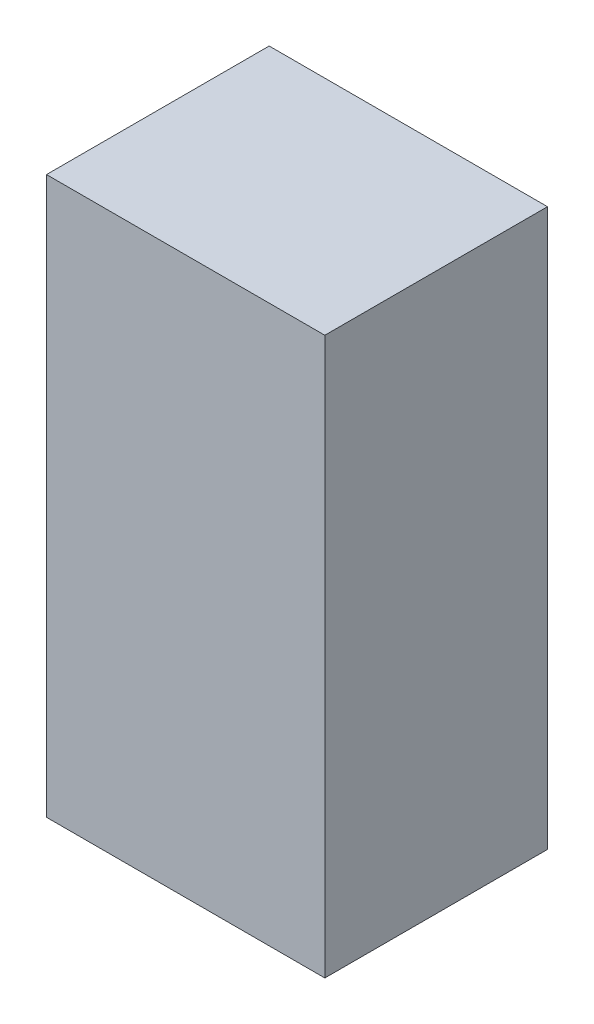
ISO-10303-21;
HEADER;
FILE_DESCRIPTION(('STEP AP214'),'2;1');
FILE_NAME('part.step','',(''),(''),'','','');
FILE_SCHEMA(('AUTOMOTIVE_DESIGN { 1 0 10303 214 1 1 1 1 }'));
ENDSEC;
DATA;
#1=APPLICATION_CONTEXT('core data for automotive mechanical design processes');
#2=APPLICATION_PROTOCOL_DEFINITION('international standard','automotive_design',2000,#1);
#3=PRODUCT_CONTEXT('',#1,'mechanical');
#4=PRODUCT('Part','Part','',(#3));
#5=PRODUCT_RELATED_PRODUCT_CATEGORY('part','',(#4));
#6=PRODUCT_DEFINITION_FORMATION('','',#4);
#7=PRODUCT_DEFINITION_CONTEXT('part definition',#1,'design');
#8=PRODUCT_DEFINITION('design','',#6,#7);
#9=PRODUCT_DEFINITION_SHAPE('','',#8);
#10=(LENGTH_UNIT() NAMED_UNIT(*) SI_UNIT(.MILLI.,.METRE.));
#11=(NAMED_UNIT(*) PLANE_ANGLE_UNIT() SI_UNIT($,.RADIAN.));
#12=(NAMED_UNIT(*) SI_UNIT($,.STERADIAN.) SOLID_ANGLE_UNIT());
#13=UNCERTAINTY_MEASURE_WITH_UNIT(LENGTH_MEASURE(1.E-05),#10,'distance_accuracy_value','');
#14=(GEOMETRIC_REPRESENTATION_CONTEXT(3) GLOBAL_UNCERTAINTY_ASSIGNED_CONTEXT((#13)) GLOBAL_UNIT_ASSIGNED_CONTEXT((#10,
#11,#12)) REPRESENTATION_CONTEXT('',''));
#15=CARTESIAN_POINT('',(0.,0.,0.));
#16=DIRECTION('',(0.,0.,1.));
#17=DIRECTION('',(1.,0.,0.));
#18=AXIS2_PLACEMENT_3D('',#15,#16,#17);
#19=CARTESIAN_POINT('',(37.5,75.,60.));
#20=DIRECTION('',(0.,-1.,0.));
#21=DIRECTION('',(0.,0.,-1.));
#22=AXIS2_PLACEMENT_3D('',#19,#20,#21);
#23=PLANE('',#22);
#24=DIRECTION('',(-1.,0.,0.));
#25=VECTOR('',#24,1.);
#26=CARTESIAN_POINT('',(37.5,75.,0.));
#27=LINE('',#26,#25);
#28=CARTESIAN_POINT('',(37.5,75.,0.));
#29=VERTEX_POINT('',#28);
#30=CARTESIAN_POINT('',(-37.5,75.,0.));
#31=VERTEX_POINT('',#30);
#32=EDGE_CURVE('E102',#29,#31,#27,.T.);
#33=ORIENTED_EDGE('',*,*,#32,.T.);
#34=DIRECTION('',(0.,0.,-1.));
#35=VECTOR('',#34,1.);
#36=CARTESIAN_POINT('',(-37.5,75.,60.));
#37=LINE('',#36,#35);
#38=CARTESIAN_POINT('',(-37.5,75.,60.));
#39=VERTEX_POINT('',#38);
#40=EDGE_CURVE('E11',#39,#31,#37,.T.);
#41=ORIENTED_EDGE('',*,*,#40,.F.);
#42=DIRECTION('',(-1.,0.,0.));
#43=VECTOR('',#42,1.);
#44=CARTESIAN_POINT('',(37.5,75.,60.));
#45=LINE('',#44,#43);
#46=CARTESIAN_POINT('',(37.5,75.,60.));
#47=VERTEX_POINT('',#46);
#48=EDGE_CURVE('E90',#47,#39,#45,.T.);
#49=ORIENTED_EDGE('',*,*,#48,.F.);
#50=DIRECTION('',(0.,0.,-1.));
#51=VECTOR('',#50,1.);
#52=CARTESIAN_POINT('',(37.5,75.,60.));
#53=LINE('',#52,#51);
#54=EDGE_CURVE('E98',#47,#29,#53,.T.);
#55=ORIENTED_EDGE('',*,*,#54,.T.);
#56=EDGE_LOOP('',(#33,#41,#49,#55));
#57=FACE_BOUND('',#56,.T.);
#58=ADVANCED_FACE('F39',(#57),#23,.F.);
#59=CARTESIAN_POINT('',(-37.5,-75.,60.));
#60=DIRECTION('',(1.,0.,0.));
#61=DIRECTION('',(0.,0.,-1.));
#62=AXIS2_PLACEMENT_3D('',#59,#60,#61);
#63=PLANE('',#62);
#64=DIRECTION('',(0.,-1.,0.));
#65=VECTOR('',#64,1.);
#66=CARTESIAN_POINT('',(-37.5,-75.,0.));
#67=LINE('',#66,#65);
#68=CARTESIAN_POINT('',(-37.5,-75.,0.));
#69=VERTEX_POINT('',#68);
#70=EDGE_CURVE('E94',#31,#69,#67,.T.);
#71=ORIENTED_EDGE('',*,*,#70,.T.);
#72=DIRECTION('',(0.,0.,-1.));
#73=VECTOR('',#72,1.);
#74=CARTESIAN_POINT('',(-37.5,-75.,60.));
#75=LINE('',#74,#73);
#76=CARTESIAN_POINT('',(-37.5,-75.,60.));
#77=VERTEX_POINT('',#76);
#78=EDGE_CURVE('E47',#77,#69,#75,.T.);
#79=ORIENTED_EDGE('',*,*,#78,.F.);
#80=DIRECTION('',(0.,-1.,0.));
#81=VECTOR('',#80,1.);
#82=CARTESIAN_POINT('',(-37.5,-75.,60.));
#83=LINE('',#82,#81);
#84=EDGE_CURVE('E85',#39,#77,#83,.T.);
#85=ORIENTED_EDGE('',*,*,#84,.F.);
#86=ORIENTED_EDGE('',*,*,#40,.T.);
#87=EDGE_LOOP('',(#71,#79,#85,#86));
#88=FACE_BOUND('',#87,.T.);
#89=ADVANCED_FACE('F93',(#88),#63,.F.);
#90=CARTESIAN_POINT('',(37.5,-75.,60.));
#91=DIRECTION('',(0.,1.,0.));
#92=DIRECTION('',(0.,0.,1.));
#93=AXIS2_PLACEMENT_3D('',#90,#91,#92);
#94=PLANE('',#93);
#95=DIRECTION('',(1.,0.,0.));
#96=VECTOR('',#95,1.);
#97=CARTESIAN_POINT('',(37.5,-75.,0.));
#98=LINE('',#97,#96);
#99=CARTESIAN_POINT('',(37.5,-75.,0.));
#100=VERTEX_POINT('',#99);
#101=EDGE_CURVE('E72',#69,#100,#98,.T.);
#102=ORIENTED_EDGE('',*,*,#101,.T.);
#103=DIRECTION('',(0.,0.,-1.));
#104=VECTOR('',#103,1.);
#105=CARTESIAN_POINT('',(37.5,-75.,60.));
#106=LINE('',#105,#104);
#107=CARTESIAN_POINT('',(37.5,-75.,60.));
#108=VERTEX_POINT('',#107);
#109=EDGE_CURVE('E95',#108,#100,#106,.T.);
#110=ORIENTED_EDGE('',*,*,#109,.F.);
#111=DIRECTION('',(1.,0.,0.));
#112=VECTOR('',#111,1.);
#113=CARTESIAN_POINT('',(37.5,-75.,60.));
#114=LINE('',#113,#112);
#115=EDGE_CURVE('E88',#77,#108,#114,.T.);
#116=ORIENTED_EDGE('',*,*,#115,.F.);
#117=ORIENTED_EDGE('',*,*,#78,.T.);
#118=EDGE_LOOP('',(#102,#110,#116,#117));
#119=FACE_BOUND('',#118,.T.);
#120=ADVANCED_FACE('F96',(#119),#94,.F.);
#121=CARTESIAN_POINT('',(37.5,-75.,60.));
#122=DIRECTION('',(-1.,0.,0.));
#123=DIRECTION('',(0.,0.,1.));
#124=AXIS2_PLACEMENT_3D('',#121,#122,#123);
#125=PLANE('',#124);
#126=DIRECTION('',(0.,1.,0.));
#127=VECTOR('',#126,1.);
#128=CARTESIAN_POINT('',(37.5,-75.,0.));
#129=LINE('',#128,#127);
#130=EDGE_CURVE('E78',#100,#29,#129,.T.);
#131=ORIENTED_EDGE('',*,*,#130,.T.);
#132=ORIENTED_EDGE('',*,*,#54,.F.);
#133=DIRECTION('',(0.,1.,0.));
#134=VECTOR('',#133,1.);
#135=CARTESIAN_POINT('',(37.5,-75.,60.));
#136=LINE('',#135,#134);
#137=EDGE_CURVE('E55',#108,#47,#136,.T.);
#138=ORIENTED_EDGE('',*,*,#137,.F.);
#139=ORIENTED_EDGE('',*,*,#109,.T.);
#140=EDGE_LOOP('',(#131,#132,#138,#139));
#141=FACE_BOUND('',#140,.T.);
#142=ADVANCED_FACE('F109',(#141),#125,.F.);
#143=CARTESIAN_POINT('',(0.,0.,60.));
#144=DIRECTION('',(0.,0.,-1.));
#145=DIRECTION('',(-1.,0.,0.));
#146=AXIS2_PLACEMENT_3D('',#143,#144,#145);
#147=PLANE('',#146);
#148=ORIENTED_EDGE('',*,*,#48,.T.);
#149=ORIENTED_EDGE('',*,*,#84,.T.);
#150=ORIENTED_EDGE('',*,*,#115,.T.);
#151=ORIENTED_EDGE('',*,*,#137,.T.);
#152=EDGE_LOOP('',(#148,#149,#150,#151));
#153=FACE_BOUND('',#152,.T.);
#154=ADVANCED_FACE('F86',(#153),#147,.F.);
#155=CARTESIAN_POINT('',(0.,0.,0.));
#156=DIRECTION('',(0.,0.,-1.));
#157=DIRECTION('',(-1.,0.,0.));
#158=AXIS2_PLACEMENT_3D('',#155,#156,#157);
#159=PLANE('',#158);
#160=ORIENTED_EDGE('',*,*,#32,.F.);
#161=ORIENTED_EDGE('',*,*,#130,.F.);
#162=ORIENTED_EDGE('',*,*,#101,.F.);
#163=ORIENTED_EDGE('',*,*,#70,.F.);
#164=EDGE_LOOP('',(#160,#161,#162,#163));
#165=FACE_BOUND('',#164,.T.);
#166=ADVANCED_FACE('F112',(#165),#159,.T.);
#167=CLOSED_SHELL('',(#58,#89,#120,#142,#154,#166));
#168=MANIFOLD_SOLID_BREP('B2',#167);
#169=ADVANCED_BREP_SHAPE_REPRESENTATION('',(#18,#168),#14);
#170=SHAPE_DEFINITION_REPRESENTATION(#9,#169);
ENDSEC;
END-ISO-10303-21;
